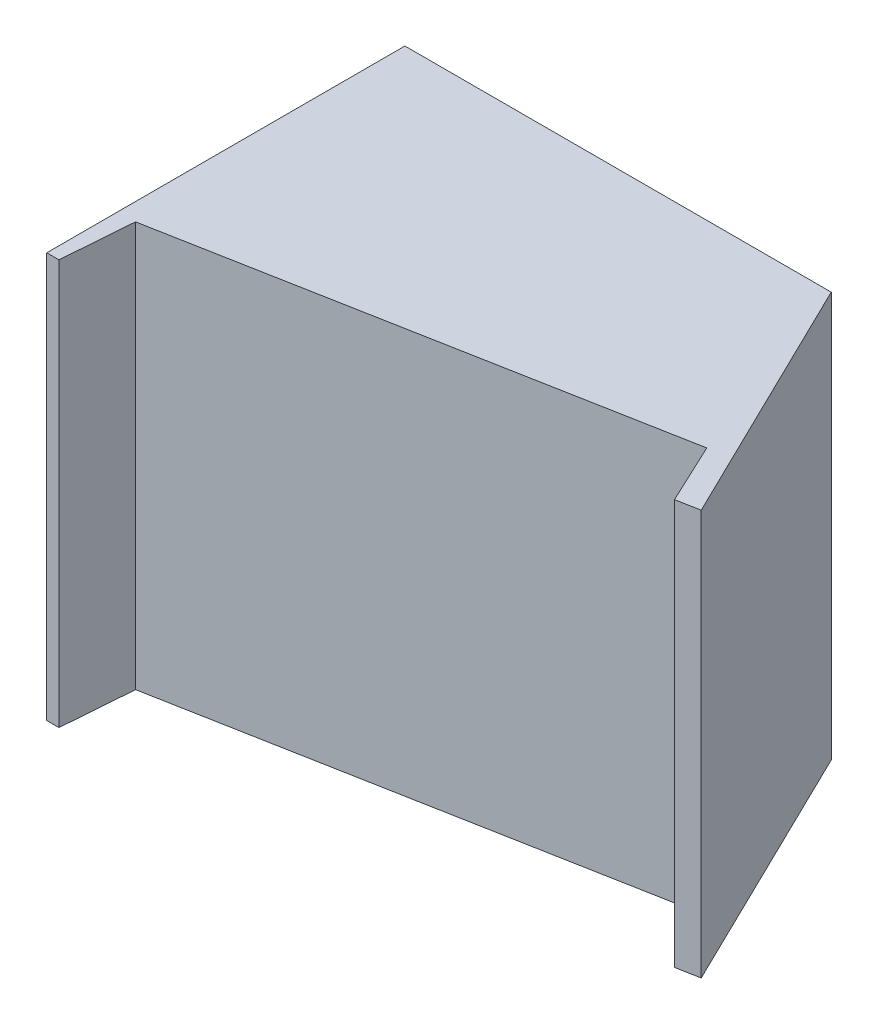
ISO-10303-21;
HEADER;
FILE_DESCRIPTION(('STEP AP214'),'2;1');
FILE_NAME('part.step','',(''),(''),'','','');
FILE_SCHEMA(('AUTOMOTIVE_DESIGN { 1 0 10303 214 1 1 1 1 }'));
ENDSEC;
DATA;
#1=APPLICATION_CONTEXT('core data for automotive mechanical design processes');
#2=APPLICATION_PROTOCOL_DEFINITION('international standard','automotive_design',2000,#1);
#3=PRODUCT_CONTEXT('',#1,'mechanical');
#4=PRODUCT('Part','Part','',(#3));
#5=PRODUCT_RELATED_PRODUCT_CATEGORY('part','',(#4));
#6=PRODUCT_DEFINITION_FORMATION('','',#4);
#7=PRODUCT_DEFINITION_CONTEXT('part definition',#1,'design');
#8=PRODUCT_DEFINITION('design','',#6,#7);
#9=PRODUCT_DEFINITION_SHAPE('','',#8);
#10=(LENGTH_UNIT() NAMED_UNIT(*) SI_UNIT(.MILLI.,.METRE.));
#11=(NAMED_UNIT(*) PLANE_ANGLE_UNIT() SI_UNIT($,.RADIAN.));
#12=(NAMED_UNIT(*) SI_UNIT($,.STERADIAN.) SOLID_ANGLE_UNIT());
#13=UNCERTAINTY_MEASURE_WITH_UNIT(LENGTH_MEASURE(1.E-05),#10,'distance_accuracy_value','');
#14=(GEOMETRIC_REPRESENTATION_CONTEXT(3) GLOBAL_UNCERTAINTY_ASSIGNED_CONTEXT((#13)) GLOBAL_UNIT_ASSIGNED_CONTEXT((#10,
#11,#12)) REPRESENTATION_CONTEXT('',''));
#15=CARTESIAN_POINT('',(0.,0.,0.));
#16=DIRECTION('',(0.,0.,1.));
#17=DIRECTION('',(1.,0.,0.));
#18=AXIS2_PLACEMENT_3D('',#15,#16,#17);
#19=CARTESIAN_POINT('',(0.,0.,378.));
#20=DIRECTION('',(0.,0.,-1.));
#21=DIRECTION('',(-1.,0.,0.));
#22=AXIS2_PLACEMENT_3D('',#19,#20,#21);
#23=PLANE('',#22);
#24=DIRECTION('',(0.,-1.,0.));
#25=VECTOR('',#24,1.);
#26=CARTESIAN_POINT('',(12.8563623155751,2028.64487270543,378.));
#27=LINE('',#26,#25);
#28=CARTESIAN_POINT('',(12.8563623155751,427.573746212538,378.));
#29=VERTEX_POINT('',#28);
#30=CARTESIAN_POINT('',(12.8563623155751,0.,378.));
#31=VERTEX_POINT('',#30);
#32=EDGE_CURVE('E174',#29,#31,#27,.T.);
#33=ORIENTED_EDGE('',*,*,#32,.F.);
#34=DIRECTION('',(-1.,0.,0.));
#35=VECTOR('',#34,1.);
#36=CARTESIAN_POINT('',(0.,427.573746212538,378.));
#37=LINE('',#36,#35);
#38=CARTESIAN_POINT('',(0.,427.573746212538,378.));
#39=VERTEX_POINT('',#38);
#40=EDGE_CURVE('E72',#29,#39,#37,.T.);
#41=ORIENTED_EDGE('',*,*,#40,.T.);
#42=DIRECTION('',(0.,-1.,0.));
#43=VECTOR('',#42,1.);
#44=CARTESIAN_POINT('',(0.,0.,378.));
#45=LINE('',#44,#43);
#46=CARTESIAN_POINT('',(0.,0.,378.));
#47=VERTEX_POINT('',#46);
#48=EDGE_CURVE('E103',#39,#47,#45,.T.);
#49=ORIENTED_EDGE('',*,*,#48,.T.);
#50=DIRECTION('',(1.,0.,0.));
#51=VECTOR('',#50,1.);
#52=CARTESIAN_POINT('',(0.,0.,378.));
#53=LINE('',#52,#51);
#54=EDGE_CURVE('E193',#47,#31,#53,.T.);
#55=ORIENTED_EDGE('',*,*,#54,.T.);
#56=EDGE_LOOP('',(#33,#41,#49,#55));
#57=FACE_BOUND('',#56,.T.);
#58=ADVANCED_FACE('F47',(#57),#23,.F.);
#59=CARTESIAN_POINT('',(0.,0.,378.));
#60=DIRECTION('',(1.,0.,0.));
#61=DIRECTION('',(0.,0.,-1.));
#62=AXIS2_PLACEMENT_3D('',#59,#60,#61);
#63=PLANE('',#62);
#64=DIRECTION('',(0.,-1.,0.));
#65=VECTOR('',#64,1.);
#66=CARTESIAN_POINT('',(0.,0.,0.));
#67=LINE('',#66,#65);
#68=CARTESIAN_POINT('',(0.,427.573746212538,0.));
#69=VERTEX_POINT('',#68);
#70=CARTESIAN_POINT('',(0.,0.,0.));
#71=VERTEX_POINT('',#70);
#72=EDGE_CURVE('E110',#69,#71,#67,.T.);
#73=ORIENTED_EDGE('',*,*,#72,.T.);
#74=DIRECTION('',(0.,0.,-1.));
#75=VECTOR('',#74,1.);
#76=CARTESIAN_POINT('',(0.,0.,378.));
#77=LINE('',#76,#75);
#78=EDGE_CURVE('E131',#47,#71,#77,.T.);
#79=ORIENTED_EDGE('',*,*,#78,.F.);
#80=ORIENTED_EDGE('',*,*,#48,.F.);
#81=DIRECTION('',(0.,0.,-1.));
#82=VECTOR('',#81,1.);
#83=CARTESIAN_POINT('',(0.,427.573746212538,378.));
#84=LINE('',#83,#82);
#85=EDGE_CURVE('E94',#39,#69,#84,.T.);
#86=ORIENTED_EDGE('',*,*,#85,.T.);
#87=EDGE_LOOP('',(#73,#79,#80,#86));
#88=FACE_BOUND('',#87,.T.);
#89=ADVANCED_FACE('F108',(#88),#63,.F.);
#90=CARTESIAN_POINT('',(0.,0.,378.));
#91=DIRECTION('',(0.,1.,0.));
#92=DIRECTION('',(0.,0.,1.));
#93=AXIS2_PLACEMENT_3D('',#90,#91,#92);
#94=PLANE('',#93);
#95=DIRECTION('',(-0.983027601832894,0.,0.18345771729385));
#96=VECTOR('',#95,1.);
#97=CARTESIAN_POINT('',(-12.9216931694108,0.,308.761260767239));
#98=LINE('',#97,#96);
#99=CARTESIAN_POINT('',(526.667256983761,0.,208.060368048142));
#100=VERTEX_POINT('',#99);
#101=CARTESIAN_POINT('',(18.6039169274223,0.,302.8777876543));
#102=VERTEX_POINT('',#101);
#103=EDGE_CURVE('E124',#100,#102,#98,.T.);
#104=ORIENTED_EDGE('',*,*,#103,.T.);
#105=DIRECTION('',(-0.0762864369454692,0.,0.997085943907628));
#106=VECTOR('',#105,1.);
#107=CARTESIAN_POINT('',(12.7815431663786,0.,378.977908065785));
#108=LINE('',#107,#106);
#109=EDGE_CURVE('E118',#102,#31,#108,.T.);
#110=ORIENTED_EDGE('',*,*,#109,.T.);
#111=ORIENTED_EDGE('',*,*,#54,.F.);
#112=ORIENTED_EDGE('',*,*,#78,.T.);
#113=DIRECTION('',(1.,0.,0.));
#114=VECTOR('',#113,1.);
#115=CARTESIAN_POINT('',(0.,0.,0.));
#116=LINE('',#115,#114);
#117=CARTESIAN_POINT('',(449.978341511889,0.,0.));
#118=VERTEX_POINT('',#117);
#119=EDGE_CURVE('E115',#71,#118,#116,.T.);
#120=ORIENTED_EDGE('',*,*,#119,.T.);
#121=DIRECTION('',(0.438371146789078,0.,0.898794046299167));
#122=VECTOR('',#121,1.);
#123=CARTESIAN_POINT('',(449.978341511889,0.,0.));
#124=LINE('',#123,#122);
#125=CARTESIAN_POINT('',(580.648945557762,0.,267.914441456742));
#126=VERTEX_POINT('',#125);
#127=EDGE_CURVE('E135',#126,#118,#124,.F.);
#128=ORIENTED_EDGE('',*,*,#127,.F.);
#129=DIRECTION('',(-0.983027601832893,0.,0.183457717293853));
#130=VECTOR('',#129,1.);
#131=CARTESIAN_POINT('',(-0.310522827366741,0.,376.33611518336));
#132=LINE('',#131,#130);
#133=CARTESIAN_POINT('',(556.854417648471,0.,272.355099853499));
#134=VERTEX_POINT('',#133);
#135=EDGE_CURVE('E178',#126,#134,#132,.T.);
#136=ORIENTED_EDGE('',*,*,#135,.T.);
#137=DIRECTION('',(-0.424999439988879,0.,-0.905193612443846));
#138=VECTOR('',#137,1.);
#139=CARTESIAN_POINT('',(496.915162715104,0.,144.69227116425));
#140=LINE('',#139,#138);
#141=EDGE_CURVE('E186',#134,#100,#140,.T.);
#142=ORIENTED_EDGE('',*,*,#141,.T.);
#143=EDGE_LOOP('',(#104,#110,#111,#112,#120,#128,#136,#142));
#144=FACE_BOUND('',#143,.T.);
#145=ADVANCED_FACE('F198',(#144),#94,.F.);
#146=CARTESIAN_POINT('',(449.978341511889,0.,0.));
#147=DIRECTION('',(0.898794046299166,0.,-0.438371146789078));
#148=DIRECTION('',(-0.438371146789078,0.,-0.898794046299167));
#149=AXIS2_PLACEMENT_3D('',#146,#147,#148);
#150=PLANE('',#149);
#151=DIRECTION('',(0.438371146789078,0.,0.898794046299167));
#152=VECTOR('',#151,1.);
#153=CARTESIAN_POINT('',(512.440367987516,427.573746212538,128.066132835806));
#154=LINE('',#153,#152);
#155=CARTESIAN_POINT('',(580.648945557762,427.573746212538,267.914441456742));
#156=VERTEX_POINT('',#155);
#157=CARTESIAN_POINT('',(449.978341511889,427.573746212538,0.));
#158=VERTEX_POINT('',#157);
#159=EDGE_CURVE('E97',#156,#158,#154,.F.);
#160=ORIENTED_EDGE('',*,*,#159,.F.);
#161=DIRECTION('',(0.,-1.,0.));
#162=VECTOR('',#161,1.);
#163=CARTESIAN_POINT('',(580.648945557762,2028.64487270543,267.914441456742));
#164=LINE('',#163,#162);
#165=EDGE_CURVE('E63',#156,#126,#164,.T.);
#166=ORIENTED_EDGE('',*,*,#165,.T.);
#167=ORIENTED_EDGE('',*,*,#127,.T.);
#168=DIRECTION('',(0.,1.,0.));
#169=VECTOR('',#168,1.);
#170=CARTESIAN_POINT('',(449.978341511889,0.,0.));
#171=LINE('',#170,#169);
#172=EDGE_CURVE('E104',#118,#158,#171,.T.);
#173=ORIENTED_EDGE('',*,*,#172,.T.);
#174=EDGE_LOOP('',(#160,#166,#167,#173));
#175=FACE_BOUND('',#174,.T.);
#176=ADVANCED_FACE('F49',(#175),#150,.T.);
#177=CARTESIAN_POINT('',(0.,427.573746212538,378.));
#178=DIRECTION('',(0.,-1.,0.));
#179=DIRECTION('',(0.,0.,-1.));
#180=AXIS2_PLACEMENT_3D('',#177,#178,#179);
#181=PLANE('',#180);
#182=ORIENTED_EDGE('',*,*,#40,.F.);
#183=DIRECTION('',(0.0762864369454692,0.,-0.997085943907628));
#184=VECTOR('',#183,1.);
#185=CARTESIAN_POINT('',(12.7815431663786,427.573746212538,378.977908065785));
#186=LINE('',#185,#184);
#187=CARTESIAN_POINT('',(18.6039169274223,427.573746212538,302.8777876543));
#188=VERTEX_POINT('',#187);
#189=EDGE_CURVE('E11',#29,#188,#186,.T.);
#190=ORIENTED_EDGE('',*,*,#189,.T.);
#191=DIRECTION('',(0.983027601832894,0.,-0.18345771729385));
#192=VECTOR('',#191,1.);
#193=CARTESIAN_POINT('',(-12.9216931694108,427.573746212538,308.761260767239));
#194=LINE('',#193,#192);
#195=CARTESIAN_POINT('',(526.667256983761,427.573746212538,208.060368048142));
#196=VERTEX_POINT('',#195);
#197=EDGE_CURVE('E56',#188,#196,#194,.T.);
#198=ORIENTED_EDGE('',*,*,#197,.T.);
#199=DIRECTION('',(0.424999439988879,0.,0.905193612443846));
#200=VECTOR('',#199,1.);
#201=CARTESIAN_POINT('',(496.915162715104,427.573746212538,144.69227116425));
#202=LINE('',#201,#200);
#203=CARTESIAN_POINT('',(556.854417648471,427.573746212538,272.355099853499));
#204=VERTEX_POINT('',#203);
#205=EDGE_CURVE('E142',#196,#204,#202,.T.);
#206=ORIENTED_EDGE('',*,*,#205,.T.);
#207=DIRECTION('',(0.983027601832893,0.,-0.183457717293853));
#208=VECTOR('',#207,1.);
#209=CARTESIAN_POINT('',(-0.310522827366741,427.573746212538,376.33611518336));
#210=LINE('',#209,#208);
#211=EDGE_CURVE('E134',#204,#156,#210,.T.);
#212=ORIENTED_EDGE('',*,*,#211,.T.);
#213=ORIENTED_EDGE('',*,*,#159,.T.);
#214=DIRECTION('',(-1.,0.,0.));
#215=VECTOR('',#214,1.);
#216=CARTESIAN_POINT('',(0.,427.573746212538,0.));
#217=LINE('',#216,#215);
#218=EDGE_CURVE('E91',#158,#69,#217,.T.);
#219=ORIENTED_EDGE('',*,*,#218,.T.);
#220=ORIENTED_EDGE('',*,*,#85,.F.);
#221=EDGE_LOOP('',(#182,#190,#198,#206,#212,#213,#219,#220));
#222=FACE_BOUND('',#221,.T.);
#223=ADVANCED_FACE('F93',(#222),#181,.F.);
#224=CARTESIAN_POINT('',(0.,0.,0.));
#225=DIRECTION('',(0.,0.,-1.));
#226=DIRECTION('',(-1.,0.,0.));
#227=AXIS2_PLACEMENT_3D('',#224,#225,#226);
#228=PLANE('',#227);
#229=ORIENTED_EDGE('',*,*,#72,.F.);
#230=ORIENTED_EDGE('',*,*,#218,.F.);
#231=ORIENTED_EDGE('',*,*,#172,.F.);
#232=ORIENTED_EDGE('',*,*,#119,.F.);
#233=EDGE_LOOP('',(#229,#230,#231,#232));
#234=FACE_BOUND('',#233,.T.);
#235=ADVANCED_FACE('F113',(#234),#228,.T.);
#236=CARTESIAN_POINT('',(12.8563623155751,2028.64487270543,378.));
#237=DIRECTION('',(-0.997085943907628,0.,-0.0762864369454692));
#238=DIRECTION('',(-0.0762864369454692,0.,0.997085943907628));
#239=AXIS2_PLACEMENT_3D('',#236,#237,#238);
#240=PLANE('',#239);
#241=ORIENTED_EDGE('',*,*,#109,.F.);
#242=DIRECTION('',(0.,-1.,0.));
#243=VECTOR('',#242,1.);
#244=CARTESIAN_POINT('',(18.6039169274223,2028.64487270543,302.8777876543));
#245=LINE('',#244,#243);
#246=EDGE_CURVE('E163',#188,#102,#245,.T.);
#247=ORIENTED_EDGE('',*,*,#246,.F.);
#248=ORIENTED_EDGE('',*,*,#189,.F.);
#249=ORIENTED_EDGE('',*,*,#32,.T.);
#250=EDGE_LOOP('',(#241,#247,#248,#249));
#251=FACE_BOUND('',#250,.T.);
#252=ADVANCED_FACE('F170',(#251),#240,.F.);
#253=CARTESIAN_POINT('',(18.6039169274223,2028.64487270543,302.8777876543));
#254=DIRECTION('',(-0.18345771729385,0.,-0.983027601832893));
#255=DIRECTION('',(-0.983027601832894,0.,0.18345771729385));
#256=AXIS2_PLACEMENT_3D('',#253,#254,#255);
#257=PLANE('',#256);
#258=ORIENTED_EDGE('',*,*,#103,.F.);
#259=DIRECTION('',(0.,-1.,0.));
#260=VECTOR('',#259,1.);
#261=CARTESIAN_POINT('',(526.667256983761,2028.64487270543,208.060368048142));
#262=LINE('',#261,#260);
#263=EDGE_CURVE('E166',#196,#100,#262,.T.);
#264=ORIENTED_EDGE('',*,*,#263,.F.);
#265=ORIENTED_EDGE('',*,*,#197,.F.);
#266=ORIENTED_EDGE('',*,*,#246,.T.);
#267=EDGE_LOOP('',(#258,#264,#265,#266));
#268=FACE_BOUND('',#267,.T.);
#269=ADVANCED_FACE('F161',(#268),#257,.F.);
#270=CARTESIAN_POINT('',(526.667256983761,2028.64487270543,208.060368048142));
#271=DIRECTION('',(0.905193612443846,0.,-0.424999439988879));
#272=DIRECTION('',(-0.424999439988879,0.,-0.905193612443846));
#273=AXIS2_PLACEMENT_3D('',#270,#271,#272);
#274=PLANE('',#273);
#275=ORIENTED_EDGE('',*,*,#141,.F.);
#276=DIRECTION('',(0.,-1.,0.));
#277=VECTOR('',#276,1.);
#278=CARTESIAN_POINT('',(556.854417648471,2028.64487270543,272.355099853499));
#279=LINE('',#278,#277);
#280=EDGE_CURVE('E206',#204,#134,#279,.T.);
#281=ORIENTED_EDGE('',*,*,#280,.F.);
#282=ORIENTED_EDGE('',*,*,#205,.F.);
#283=ORIENTED_EDGE('',*,*,#263,.T.);
#284=EDGE_LOOP('',(#275,#281,#282,#283));
#285=FACE_BOUND('',#284,.T.);
#286=ADVANCED_FACE('F203',(#285),#274,.F.);
#287=CARTESIAN_POINT('',(556.854417648471,2028.64487270543,272.355099853499));
#288=DIRECTION('',(-0.183457717293853,0.,-0.983027601832893));
#289=DIRECTION('',(-0.983027601832893,0.,0.183457717293853));
#290=AXIS2_PLACEMENT_3D('',#287,#288,#289);
#291=PLANE('',#290);
#292=ORIENTED_EDGE('',*,*,#135,.F.);
#293=ORIENTED_EDGE('',*,*,#165,.F.);
#294=ORIENTED_EDGE('',*,*,#211,.F.);
#295=ORIENTED_EDGE('',*,*,#280,.T.);
#296=EDGE_LOOP('',(#292,#293,#294,#295));
#297=FACE_BOUND('',#296,.T.);
#298=ADVANCED_FACE('F216',(#297),#291,.F.);
#299=CLOSED_SHELL('',(#58,#89,#145,#176,#223,#235,#252,#269,#286,#298));
#300=MANIFOLD_SOLID_BREP('B2',#299);
#301=ADVANCED_BREP_SHAPE_REPRESENTATION('',(#18,#300),#14);
#302=SHAPE_DEFINITION_REPRESENTATION(#9,#301);
ENDSEC;
END-ISO-10303-21;
